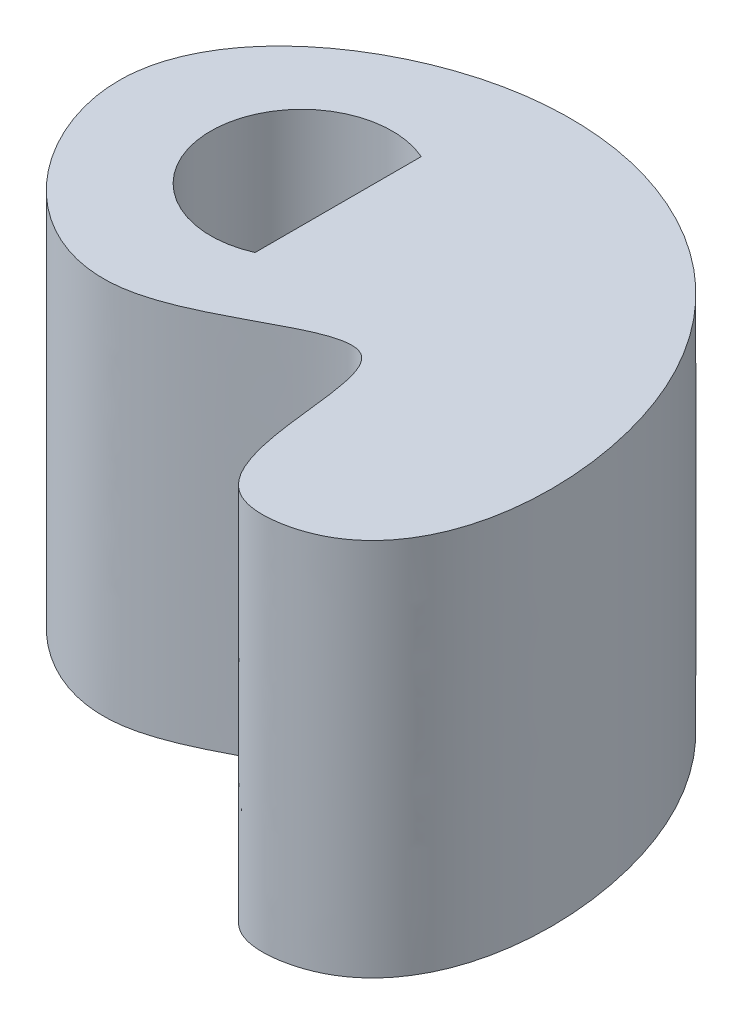
ISO-10303-21;
HEADER;
FILE_DESCRIPTION(('STEP AP214'),'2;1');
FILE_NAME('part.step','',(''),(''),'','','');
FILE_SCHEMA(('AUTOMOTIVE_DESIGN { 1 0 10303 214 1 1 1 1 }'));
ENDSEC;
DATA;
#1=APPLICATION_CONTEXT('core data for automotive mechanical design processes');
#2=APPLICATION_PROTOCOL_DEFINITION('international standard','automotive_design',2000,#1);
#3=PRODUCT_CONTEXT('',#1,'mechanical');
#4=PRODUCT('Part','Part','',(#3));
#5=PRODUCT_RELATED_PRODUCT_CATEGORY('part','',(#4));
#6=PRODUCT_DEFINITION_FORMATION('','',#4);
#7=PRODUCT_DEFINITION_CONTEXT('part definition',#1,'design');
#8=PRODUCT_DEFINITION('design','',#6,#7);
#9=PRODUCT_DEFINITION_SHAPE('','',#8);
#10=(LENGTH_UNIT() NAMED_UNIT(*) SI_UNIT(.MILLI.,.METRE.));
#11=(NAMED_UNIT(*) PLANE_ANGLE_UNIT() SI_UNIT($,.RADIAN.));
#12=(NAMED_UNIT(*) SI_UNIT($,.STERADIAN.) SOLID_ANGLE_UNIT());
#13=UNCERTAINTY_MEASURE_WITH_UNIT(LENGTH_MEASURE(1.E-05),#10,'distance_accuracy_value','');
#14=(GEOMETRIC_REPRESENTATION_CONTEXT(3) GLOBAL_UNCERTAINTY_ASSIGNED_CONTEXT((#13)) GLOBAL_UNIT_ASSIGNED_CONTEXT((#10,
#11,#12)) REPRESENTATION_CONTEXT('',''));
#15=CARTESIAN_POINT('',(0.,0.,0.));
#16=DIRECTION('',(0.,0.,1.));
#17=DIRECTION('',(1.,0.,0.));
#18=AXIS2_PLACEMENT_3D('',#15,#16,#17);
#19=CARTESIAN_POINT('',(6.36818356779855,6.3,3.32651849023443));
#20=DIRECTION('',(0.,1.,0.));
#21=DIRECTION('',(0.,0.,1.));
#22=AXIS2_PLACEMENT_3D('',#19,#20,#21);
#23=PLANE('',#22);
#24=CARTESIAN_POINT('',(-3.,6.3,0.));
#25=CARTESIAN_POINT('',(-3.02322666796111,6.3,1.45344068381636));
#26=CARTESIAN_POINT('',(-0.561402622069291,6.3,4.53647722286951));
#27=CARTESIAN_POINT('',(3.83086424186517,6.3,0.30138574952068));
#28=CARTESIAN_POINT('',(3.02638221633484,6.3,5.2346257881594));
#29=CARTESIAN_POINT('',(6.67777271470007,6.3,4.95395576821967));
#30=CARTESIAN_POINT('',(6.90932520150059,6.3,-1.54088596523216));
#31=CARTESIAN_POINT('',(0.783824636929652,6.3,-4.39712269546271));
#32=CARTESIAN_POINT('',(-2.97677333203889,6.3,-1.45344068381636));
#33=CARTESIAN_POINT('',(-3.,6.3,0.));
#34=B_SPLINE_CURVE_WITH_KNOTS('',3,(#24,#25,#26,#27,#28,#29,#30,#31,#32,#33),.UNSPECIFIED.,.T.,
.F.,(4,1,1,1,1,1,1,4),(0.,0.153623907306187,0.268128407208107,0.382632907110027,
0.418842409312886,0.603475367622747,0.846376092693813,1.),.UNSPECIFIED.);
#35=CARTESIAN_POINT('',(-3.,6.3,0.));
#36=VERTEX_POINT('',#35);
#37=EDGE_CURVE('E11',#36,#36,#34,.T.);
#38=ORIENTED_EDGE('',*,*,#37,.T.);
#39=EDGE_LOOP('',(#38));
#40=FACE_BOUND('',#39,.T.);
#41=DIRECTION('',(0.,0.,-1.));
#42=VECTOR('',#41,1.);
#43=CARTESIAN_POINT('',(0.609188600062337,6.3,-1.38166177104025));
#44=LINE('',#43,#42);
#45=CARTESIAN_POINT('',(0.609188600062337,6.3,1.38166177104025));
#46=VERTEX_POINT('',#45);
#47=CARTESIAN_POINT('',(0.609188600062337,6.3,-1.38166177104025));
#48=VERTEX_POINT('',#47);
#49=EDGE_CURVE('E86',#46,#48,#44,.T.);
#50=ORIENTED_EDGE('',*,*,#49,.F.);
#51=CARTESIAN_POINT('',(0.,6.3,0.));
#52=DIRECTION('',(0.,1.,0.));
#53=DIRECTION('',(0.,0.,1.));
#54=AXIS2_PLACEMENT_3D('',#51,#52,#53);
#55=CIRCLE('',#54,1.51);
#56=EDGE_CURVE('E75',#48,#46,#55,.T.);
#57=ORIENTED_EDGE('',*,*,#56,.F.);
#58=EDGE_LOOP('',(#50,#57));
#59=FACE_BOUND('',#58,.T.);
#60=ADVANCED_FACE('F39',(#40,#59),#23,.T.);
#61=CARTESIAN_POINT('',(6.36818356779855,0.,3.32651849023443));
#62=DIRECTION('',(0.,1.,0.));
#63=DIRECTION('',(0.,0.,1.));
#64=AXIS2_PLACEMENT_3D('',#61,#62,#63);
#65=PLANE('',#64);
#66=CARTESIAN_POINT('',(-3.,0.,0.));
#67=CARTESIAN_POINT('',(-3.02322666796111,0.,1.45344068381636));
#68=CARTESIAN_POINT('',(-0.561402622069291,0.,4.53647722286951));
#69=CARTESIAN_POINT('',(3.83086424186517,0.,0.30138574952068));
#70=CARTESIAN_POINT('',(3.02638221633484,0.,5.2346257881594));
#71=CARTESIAN_POINT('',(6.67777271470007,0.,4.95395576821967));
#72=CARTESIAN_POINT('',(6.90932520150059,0.,-1.54088596523216));
#73=CARTESIAN_POINT('',(0.783824636929652,0.,-4.39712269546271));
#74=CARTESIAN_POINT('',(-2.97677333203889,0.,-1.45344068381636));
#75=CARTESIAN_POINT('',(-3.,0.,0.));
#76=B_SPLINE_CURVE_WITH_KNOTS('',3,(#66,#67,#68,#69,#70,#71,#72,#73,#74,#75),.UNSPECIFIED.,.T.,
.F.,(4,1,1,1,1,1,1,4),(0.,0.153623907306187,0.268128407208107,0.382632907110027,
0.418842409312886,0.603475367622747,0.846376092693813,1.),.UNSPECIFIED.);
#77=CARTESIAN_POINT('',(-3.,0.,0.));
#78=VERTEX_POINT('',#77);
#79=EDGE_CURVE('E44',#78,#78,#76,.T.);
#80=ORIENTED_EDGE('',*,*,#79,.F.);
#81=EDGE_LOOP('',(#80));
#82=FACE_BOUND('',#81,.T.);
#83=CARTESIAN_POINT('',(0.,0.,0.));
#84=DIRECTION('',(0.,1.,0.));
#85=DIRECTION('',(0.,0.,1.));
#86=AXIS2_PLACEMENT_3D('',#83,#84,#85);
#87=CIRCLE('',#86,1.51);
#88=CARTESIAN_POINT('',(0.609188600062337,0.,-1.38166177104025));
#89=VERTEX_POINT('',#88);
#90=CARTESIAN_POINT('',(0.609188600062337,0.,1.38166177104025));
#91=VERTEX_POINT('',#90);
#92=EDGE_CURVE('E64',#89,#91,#87,.T.);
#93=ORIENTED_EDGE('',*,*,#92,.T.);
#94=DIRECTION('',(0.,0.,-1.));
#95=VECTOR('',#94,1.);
#96=CARTESIAN_POINT('',(0.609188600062337,0.,-1.38166177104025));
#97=LINE('',#96,#95);
#98=EDGE_CURVE('E70',#91,#89,#97,.T.);
#99=ORIENTED_EDGE('',*,*,#98,.T.);
#100=EDGE_LOOP('',(#93,#99));
#101=FACE_BOUND('',#100,.T.);
#102=ADVANCED_FACE('F82',(#82,#101),#65,.F.);
#103=DIRECTION('',(0.,-1.,0.));
#104=VECTOR('',#103,1.);
#105=SURFACE_OF_LINEAR_EXTRUSION('',#34,#104);
#106=ORIENTED_EDGE('',*,*,#37,.F.);
#107=EDGE_LOOP('',(#106));
#108=FACE_BOUND('',#107,.T.);
#109=ORIENTED_EDGE('',*,*,#79,.T.);
#110=EDGE_LOOP('',(#109));
#111=FACE_BOUND('',#110,.T.);
#112=ADVANCED_FACE('F41',(#108,#111),#105,.F.);
#113=CARTESIAN_POINT('',(0.,6.3,0.));
#114=DIRECTION('',(0.,-1.,0.));
#115=DIRECTION('',(0.,0.,-1.));
#116=AXIS2_PLACEMENT_3D('',#113,#114,#115);
#117=CYLINDRICAL_SURFACE('',#116,1.51);
#118=ORIENTED_EDGE('',*,*,#92,.F.);
#119=DIRECTION('',(0.,-1.,0.));
#120=VECTOR('',#119,1.);
#121=CARTESIAN_POINT('',(0.609188600062337,6.3,-1.38166177104025));
#122=LINE('',#121,#120);
#123=EDGE_CURVE('E72',#48,#89,#122,.T.);
#124=ORIENTED_EDGE('',*,*,#123,.F.);
#125=ORIENTED_EDGE('',*,*,#56,.T.);
#126=DIRECTION('',(0.,-1.,0.));
#127=VECTOR('',#126,1.);
#128=CARTESIAN_POINT('',(0.609188600062337,6.3,1.38166177104025));
#129=LINE('',#128,#127);
#130=EDGE_CURVE('E57',#46,#91,#129,.T.);
#131=ORIENTED_EDGE('',*,*,#130,.T.);
#132=EDGE_LOOP('',(#118,#124,#125,#131));
#133=FACE_BOUND('',#132,.T.);
#134=ADVANCED_FACE('F77',(#133),#117,.F.);
#135=CARTESIAN_POINT('',(0.609188600062337,6.3,-1.38166177104025));
#136=DIRECTION('',(-1.,0.,0.));
#137=DIRECTION('',(0.,0.,1.));
#138=AXIS2_PLACEMENT_3D('',#135,#136,#137);
#139=PLANE('',#138);
#140=ORIENTED_EDGE('',*,*,#98,.F.);
#141=ORIENTED_EDGE('',*,*,#130,.F.);
#142=ORIENTED_EDGE('',*,*,#49,.T.);
#143=ORIENTED_EDGE('',*,*,#123,.T.);
#144=EDGE_LOOP('',(#140,#141,#142,#143));
#145=FACE_BOUND('',#144,.T.);
#146=ADVANCED_FACE('F71',(#145),#139,.T.);
#147=CLOSED_SHELL('',(#60,#102,#112,#134,#146));
#148=MANIFOLD_SOLID_BREP('B2',#147);
#149=ADVANCED_BREP_SHAPE_REPRESENTATION('',(#18,#148),#14);
#150=SHAPE_DEFINITION_REPRESENTATION(#9,#149);
ENDSEC;
END-ISO-10303-21;
